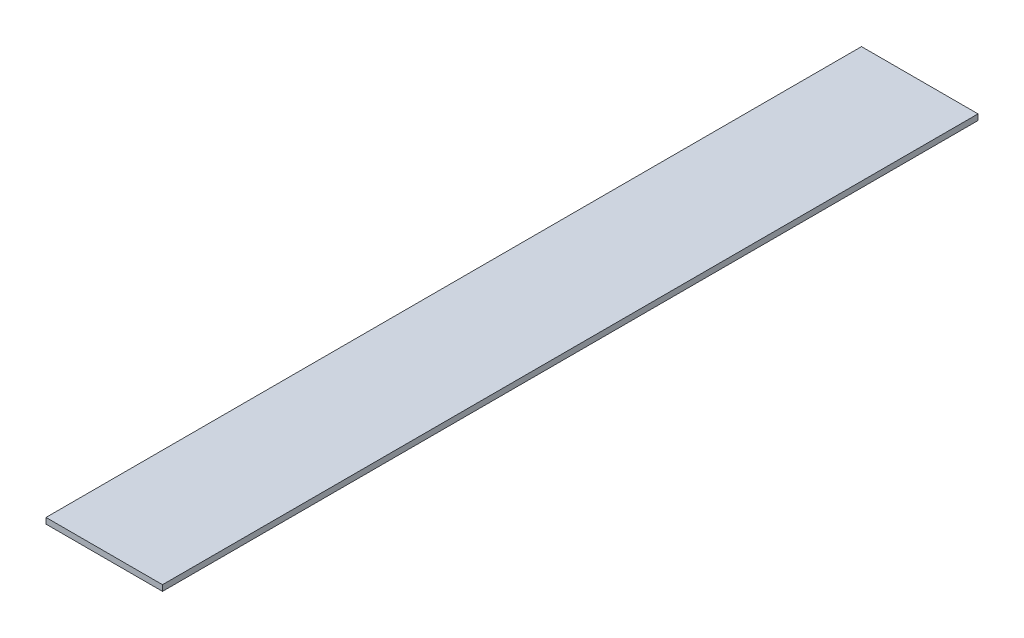
ISO-10303-21;
HEADER;
FILE_DESCRIPTION(('STEP AP214'),'2;1');
FILE_NAME('part.step','',(''),(''),'','','');
FILE_SCHEMA(('AUTOMOTIVE_DESIGN { 1 0 10303 214 1 1 1 1 }'));
ENDSEC;
DATA;
#1=APPLICATION_CONTEXT('core data for automotive mechanical design processes');
#2=APPLICATION_PROTOCOL_DEFINITION('international standard','automotive_design',2000,#1);
#3=PRODUCT_CONTEXT('',#1,'mechanical');
#4=PRODUCT('Part','Part','',(#3));
#5=PRODUCT_RELATED_PRODUCT_CATEGORY('part','',(#4));
#6=PRODUCT_DEFINITION_FORMATION('','',#4);
#7=PRODUCT_DEFINITION_CONTEXT('part definition',#1,'design');
#8=PRODUCT_DEFINITION('design','',#6,#7);
#9=PRODUCT_DEFINITION_SHAPE('','',#8);
#10=(LENGTH_UNIT() NAMED_UNIT(*) SI_UNIT(.MILLI.,.METRE.));
#11=(NAMED_UNIT(*) PLANE_ANGLE_UNIT() SI_UNIT($,.RADIAN.));
#12=(NAMED_UNIT(*) SI_UNIT($,.STERADIAN.) SOLID_ANGLE_UNIT());
#13=UNCERTAINTY_MEASURE_WITH_UNIT(LENGTH_MEASURE(1.E-05),#10,'distance_accuracy_value','');
#14=(GEOMETRIC_REPRESENTATION_CONTEXT(3) GLOBAL_UNCERTAINTY_ASSIGNED_CONTEXT((#13)) GLOBAL_UNIT_ASSIGNED_CONTEXT((#10,
#11,#12)) REPRESENTATION_CONTEXT('',''));
#15=CARTESIAN_POINT('',(0.,0.,0.));
#16=DIRECTION('',(0.,0.,1.));
#17=DIRECTION('',(1.,0.,0.));
#18=AXIS2_PLACEMENT_3D('',#15,#16,#17);
#19=CARTESIAN_POINT('',(50.,5.,350.));
#20=DIRECTION('',(0.,1.,0.));
#21=DIRECTION('',(1.,0.,0.));
#22=AXIS2_PLACEMENT_3D('',#19,#20,#21);
#23=PLANE('',#22);
#24=DIRECTION('',(-1.,0.,0.));
#25=VECTOR('',#24,1.);
#26=CARTESIAN_POINT('',(0.,5.,0.));
#27=LINE('',#26,#25);
#28=CARTESIAN_POINT('',(100.,5.,0.));
#29=VERTEX_POINT('',#28);
#30=CARTESIAN_POINT('',(0.,5.,0.));
#31=VERTEX_POINT('',#30);
#32=EDGE_CURVE('E11',#29,#31,#27,.T.);
#33=ORIENTED_EDGE('',*,*,#32,.T.);
#34=DIRECTION('',(0.,0.,1.));
#35=VECTOR('',#34,1.);
#36=CARTESIAN_POINT('',(2.14313189850787E-13,5.,700.));
#37=LINE('',#36,#35);
#38=CARTESIAN_POINT('',(2.14313189850787E-13,5.,700.));
#39=VERTEX_POINT('',#38);
#40=EDGE_CURVE('E73',#31,#39,#37,.T.);
#41=ORIENTED_EDGE('',*,*,#40,.T.);
#42=DIRECTION('',(1.,0.,0.));
#43=VECTOR('',#42,1.);
#44=CARTESIAN_POINT('',(100.,5.,700.));
#45=LINE('',#44,#43);
#46=CARTESIAN_POINT('',(100.,5.,700.));
#47=VERTEX_POINT('',#46);
#48=EDGE_CURVE('E89',#39,#47,#45,.T.);
#49=ORIENTED_EDGE('',*,*,#48,.T.);
#50=DIRECTION('',(0.,0.,-1.));
#51=VECTOR('',#50,1.);
#52=CARTESIAN_POINT('',(100.,5.,0.));
#53=LINE('',#52,#51);
#54=EDGE_CURVE('E105',#47,#29,#53,.T.);
#55=ORIENTED_EDGE('',*,*,#54,.T.);
#56=EDGE_LOOP('',(#33,#41,#49,#55));
#57=FACE_BOUND('',#56,.T.);
#58=ADVANCED_FACE('F17',(#57),#23,.T.);
#59=CARTESIAN_POINT('',(50.,0.,350.));
#60=DIRECTION('',(0.,-1.,0.));
#61=DIRECTION('',(0.,0.,-1.));
#62=AXIS2_PLACEMENT_3D('',#59,#60,#61);
#63=PLANE('',#62);
#64=DIRECTION('',(1.,0.,0.));
#65=VECTOR('',#64,1.);
#66=CARTESIAN_POINT('',(0.,0.,0.));
#67=LINE('',#66,#65);
#68=CARTESIAN_POINT('',(0.,0.,0.));
#69=VERTEX_POINT('',#68);
#70=CARTESIAN_POINT('',(100.,0.,0.));
#71=VERTEX_POINT('',#70);
#72=EDGE_CURVE('E21',#69,#71,#67,.T.);
#73=ORIENTED_EDGE('',*,*,#72,.T.);
#74=DIRECTION('',(0.,0.,1.));
#75=VECTOR('',#74,1.);
#76=CARTESIAN_POINT('',(100.,0.,0.));
#77=LINE('',#76,#75);
#78=CARTESIAN_POINT('',(100.,0.,700.));
#79=VERTEX_POINT('',#78);
#80=EDGE_CURVE('E95',#71,#79,#77,.T.);
#81=ORIENTED_EDGE('',*,*,#80,.T.);
#82=DIRECTION('',(-1.,0.,0.));
#83=VECTOR('',#82,1.);
#84=CARTESIAN_POINT('',(100.,0.,700.));
#85=LINE('',#84,#83);
#86=CARTESIAN_POINT('',(2.14313189850787E-13,0.,700.));
#87=VERTEX_POINT('',#86);
#88=EDGE_CURVE('E66',#79,#87,#85,.T.);
#89=ORIENTED_EDGE('',*,*,#88,.T.);
#90=DIRECTION('',(0.,0.,-1.));
#91=VECTOR('',#90,1.);
#92=CARTESIAN_POINT('',(2.14313189850787E-13,0.,700.));
#93=LINE('',#92,#91);
#94=EDGE_CURVE('E81',#87,#69,#93,.T.);
#95=ORIENTED_EDGE('',*,*,#94,.T.);
#96=EDGE_LOOP('',(#73,#81,#89,#95));
#97=FACE_BOUND('',#96,.T.);
#98=ADVANCED_FACE('F93',(#97),#63,.T.);
#99=CARTESIAN_POINT('',(100.,0.,0.));
#100=DIRECTION('',(0.,0.,-1.));
#101=DIRECTION('',(-1.,0.,0.));
#102=AXIS2_PLACEMENT_3D('',#99,#100,#101);
#103=PLANE('',#102);
#104=ORIENTED_EDGE('',*,*,#72,.F.);
#105=DIRECTION('',(0.,1.,0.));
#106=VECTOR('',#105,1.);
#107=CARTESIAN_POINT('',(0.,0.,0.));
#108=LINE('',#107,#106);
#109=EDGE_CURVE('E85',#69,#31,#108,.T.);
#110=ORIENTED_EDGE('',*,*,#109,.T.);
#111=ORIENTED_EDGE('',*,*,#32,.F.);
#112=DIRECTION('',(0.,1.,0.));
#113=VECTOR('',#112,1.);
#114=CARTESIAN_POINT('',(100.,0.,0.));
#115=LINE('',#114,#113);
#116=EDGE_CURVE('E110',#71,#29,#115,.T.);
#117=ORIENTED_EDGE('',*,*,#116,.F.);
#118=EDGE_LOOP('',(#104,#110,#111,#117));
#119=FACE_BOUND('',#118,.T.);
#120=ADVANCED_FACE('F19',(#119),#103,.T.);
#121=CARTESIAN_POINT('',(0.,0.,0.));
#122=DIRECTION('',(-1.,0.,0.));
#123=DIRECTION('',(0.,1.,0.));
#124=AXIS2_PLACEMENT_3D('',#121,#122,#123);
#125=PLANE('',#124);
#126=ORIENTED_EDGE('',*,*,#94,.F.);
#127=DIRECTION('',(0.,1.,0.));
#128=VECTOR('',#127,1.);
#129=CARTESIAN_POINT('',(2.14313189850787E-13,0.,700.));
#130=LINE('',#129,#128);
#131=EDGE_CURVE('E83',#87,#39,#130,.T.);
#132=ORIENTED_EDGE('',*,*,#131,.T.);
#133=ORIENTED_EDGE('',*,*,#40,.F.);
#134=ORIENTED_EDGE('',*,*,#109,.F.);
#135=EDGE_LOOP('',(#126,#132,#133,#134));
#136=FACE_BOUND('',#135,.T.);
#137=ADVANCED_FACE('F82',(#136),#125,.T.);
#138=CARTESIAN_POINT('',(2.1316282072803E-13,0.,700.));
#139=DIRECTION('',(0.,0.,1.));
#140=DIRECTION('',(1.,0.,0.));
#141=AXIS2_PLACEMENT_3D('',#138,#139,#140);
#142=PLANE('',#141);
#143=ORIENTED_EDGE('',*,*,#88,.F.);
#144=DIRECTION('',(0.,1.,0.));
#145=VECTOR('',#144,1.);
#146=CARTESIAN_POINT('',(100.,0.,700.));
#147=LINE('',#146,#145);
#148=EDGE_CURVE('E97',#79,#47,#147,.T.);
#149=ORIENTED_EDGE('',*,*,#148,.T.);
#150=ORIENTED_EDGE('',*,*,#48,.F.);
#151=ORIENTED_EDGE('',*,*,#131,.F.);
#152=EDGE_LOOP('',(#143,#149,#150,#151));
#153=FACE_BOUND('',#152,.T.);
#154=ADVANCED_FACE('F88',(#153),#142,.T.);
#155=CARTESIAN_POINT('',(100.,0.,700.));
#156=DIRECTION('',(1.,0.,0.));
#157=DIRECTION('',(0.,0.,-1.));
#158=AXIS2_PLACEMENT_3D('',#155,#156,#157);
#159=PLANE('',#158);
#160=ORIENTED_EDGE('',*,*,#80,.F.);
#161=ORIENTED_EDGE('',*,*,#116,.T.);
#162=ORIENTED_EDGE('',*,*,#54,.F.);
#163=ORIENTED_EDGE('',*,*,#148,.F.);
#164=EDGE_LOOP('',(#160,#161,#162,#163));
#165=FACE_BOUND('',#164,.T.);
#166=ADVANCED_FACE('F128',(#165),#159,.T.);
#167=CLOSED_SHELL('',(#58,#98,#120,#137,#154,#166));
#168=MANIFOLD_SOLID_BREP('B1',#167);
#169=ADVANCED_BREP_SHAPE_REPRESENTATION('',(#18,#168),#14);
#170=SHAPE_DEFINITION_REPRESENTATION(#9,#169);
ENDSEC;
END-ISO-10303-21;
